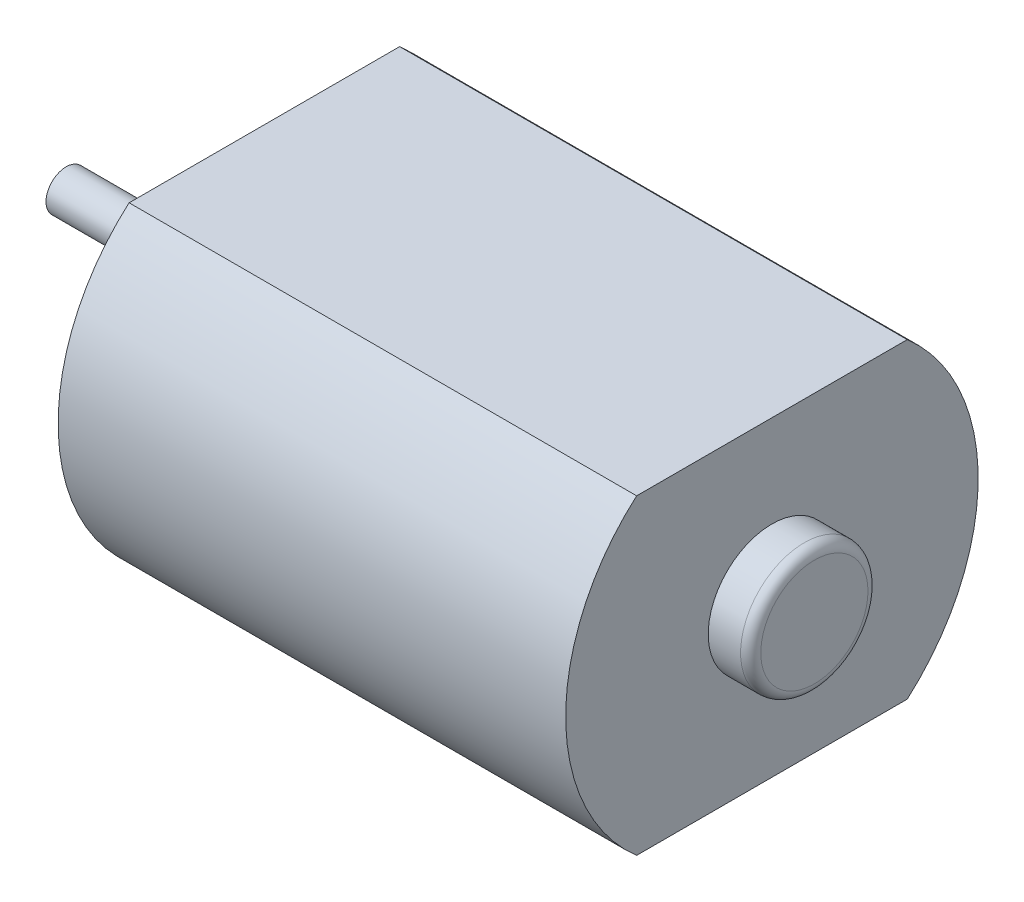
ISO-10303-21;
HEADER;
FILE_DESCRIPTION(('STEP AP214'),'2;1');
FILE_NAME('part.step','',(''),(''),'','','');
FILE_SCHEMA(('AUTOMOTIVE_DESIGN { 1 0 10303 214 1 1 1 1 }'));
ENDSEC;
DATA;
#1=APPLICATION_CONTEXT('core data for automotive mechanical design processes');
#2=APPLICATION_PROTOCOL_DEFINITION('international standard','automotive_design',2000,#1);
#3=PRODUCT_CONTEXT('',#1,'mechanical');
#4=PRODUCT('Part','Part','',(#3));
#5=PRODUCT_RELATED_PRODUCT_CATEGORY('part','',(#4));
#6=PRODUCT_DEFINITION_FORMATION('','',#4);
#7=PRODUCT_DEFINITION_CONTEXT('part definition',#1,'design');
#8=PRODUCT_DEFINITION('design','',#6,#7);
#9=PRODUCT_DEFINITION_SHAPE('','',#8);
#10=(LENGTH_UNIT() NAMED_UNIT(*) SI_UNIT(.MILLI.,.METRE.));
#11=(NAMED_UNIT(*) PLANE_ANGLE_UNIT() SI_UNIT($,.RADIAN.));
#12=(NAMED_UNIT(*) SI_UNIT($,.STERADIAN.) SOLID_ANGLE_UNIT());
#13=UNCERTAINTY_MEASURE_WITH_UNIT(LENGTH_MEASURE(1.E-05),#10,'distance_accuracy_value','');
#14=(GEOMETRIC_REPRESENTATION_CONTEXT(3) GLOBAL_UNCERTAINTY_ASSIGNED_CONTEXT((#13)) GLOBAL_UNIT_ASSIGNED_CONTEXT((#10,
#11,#12)) REPRESENTATION_CONTEXT('',''));
#15=CARTESIAN_POINT('',(0.,0.,0.));
#16=DIRECTION('',(0.,0.,1.));
#17=DIRECTION('',(1.,0.,0.));
#18=AXIS2_PLACEMENT_3D('',#15,#16,#17);
#19=CARTESIAN_POINT('',(25.1,0.,0.));
#20=DIRECTION('',(-1.,0.,0.));
#21=DIRECTION('',(0.,0.,1.));
#22=AXIS2_PLACEMENT_3D('',#19,#20,#21);
#23=CYLINDRICAL_SURFACE('',#22,10.2);
#24=DIRECTION('',(-1.,0.,0.));
#25=VECTOR('',#24,1.);
#26=CARTESIAN_POINT('',(25.1,-7.7,6.68954408012982));
#27=LINE('',#26,#25);
#28=CARTESIAN_POINT('',(25.1,-7.7,6.68954408012982));
#29=VERTEX_POINT('',#28);
#30=CARTESIAN_POINT('',(0.,-7.7,6.68954408012982));
#31=VERTEX_POINT('',#30);
#32=EDGE_CURVE('E54',#29,#31,#27,.T.);
#33=ORIENTED_EDGE('',*,*,#32,.F.);
#34=CARTESIAN_POINT('',(25.1,0.,0.));
#35=DIRECTION('',(1.,0.,0.));
#36=DIRECTION('',(0.,0.,-1.));
#37=AXIS2_PLACEMENT_3D('',#34,#35,#36);
#38=CIRCLE('',#37,10.2);
#39=CARTESIAN_POINT('',(25.1,7.7,6.68954408012983));
#40=VERTEX_POINT('',#39);
#41=EDGE_CURVE('E87',#40,#29,#38,.T.);
#42=ORIENTED_EDGE('',*,*,#41,.F.);
#43=DIRECTION('',(-1.,0.,0.));
#44=VECTOR('',#43,1.);
#45=CARTESIAN_POINT('',(25.1,7.7,6.68954408012983));
#46=LINE('',#45,#44);
#47=CARTESIAN_POINT('',(0.,7.7,6.68954408012983));
#48=VERTEX_POINT('',#47);
#49=EDGE_CURVE('E80',#48,#40,#46,.F.);
#50=ORIENTED_EDGE('',*,*,#49,.F.);
#51=CARTESIAN_POINT('',(0.,0.,0.));
#52=DIRECTION('',(1.,0.,0.));
#53=DIRECTION('',(0.,0.,-1.));
#54=AXIS2_PLACEMENT_3D('',#51,#52,#53);
#55=CIRCLE('',#54,10.2);
#56=EDGE_CURVE('E92',#48,#31,#55,.T.);
#57=ORIENTED_EDGE('',*,*,#56,.T.);
#58=EDGE_LOOP('',(#33,#42,#50,#57));
#59=FACE_BOUND('',#58,.T.);
#60=ADVANCED_FACE('F37',(#59),#23,.T.);
#61=DIRECTION('',(-1.,0.,0.));
#62=VECTOR('',#61,1.);
#63=CARTESIAN_POINT('',(25.1,-7.7,-6.68954408012982));
#64=LINE('',#63,#62);
#65=CARTESIAN_POINT('',(0.,-7.7,-6.68954408012982));
#66=VERTEX_POINT('',#65);
#67=CARTESIAN_POINT('',(25.1,-7.7,-6.68954408012982));
#68=VERTEX_POINT('',#67);
#69=EDGE_CURVE('E281',#66,#68,#64,.F.);
#70=ORIENTED_EDGE('',*,*,#69,.F.);
#71=CARTESIAN_POINT('',(0.,7.7,-6.68954408012983));
#72=VERTEX_POINT('',#71);
#73=EDGE_CURVE('E98',#66,#72,#55,.T.);
#74=ORIENTED_EDGE('',*,*,#73,.T.);
#75=DIRECTION('',(-1.,0.,0.));
#76=VECTOR('',#75,1.);
#77=CARTESIAN_POINT('',(25.1,7.7,-6.68954408012983));
#78=LINE('',#77,#76);
#79=CARTESIAN_POINT('',(25.1,7.7,-6.68954408012983));
#80=VERTEX_POINT('',#79);
#81=EDGE_CURVE('E62',#80,#72,#78,.T.);
#82=ORIENTED_EDGE('',*,*,#81,.F.);
#83=EDGE_CURVE('E97',#68,#80,#38,.T.);
#84=ORIENTED_EDGE('',*,*,#83,.F.);
#85=EDGE_LOOP('',(#70,#74,#82,#84));
#86=FACE_BOUND('',#85,.T.);
#87=ADVANCED_FACE('F129',(#86),#23,.T.);
#88=CARTESIAN_POINT('',(25.1,0.,0.));
#89=DIRECTION('',(1.,0.,0.));
#90=DIRECTION('',(0.,0.,-1.));
#91=AXIS2_PLACEMENT_3D('',#88,#89,#90);
#92=PLANE('',#91);
#93=CARTESIAN_POINT('',(25.1,0.,0.));
#94=DIRECTION('',(1.,0.,0.));
#95=DIRECTION('',(0.,0.,-1.));
#96=AXIS2_PLACEMENT_3D('',#93,#94,#95);
#97=CIRCLE('',#96,3.15);
#98=CARTESIAN_POINT('',(25.1,0.,-3.15));
#99=VERTEX_POINT('',#98);
#100=EDGE_CURVE('E105',#99,#99,#97,.T.);
#101=ORIENTED_EDGE('',*,*,#100,.F.);
#102=EDGE_LOOP('',(#101));
#103=FACE_BOUND('',#102,.T.);
#104=ORIENTED_EDGE('',*,*,#41,.T.);
#105=DIRECTION('',(0.,0.,-1.));
#106=VECTOR('',#105,1.);
#107=CARTESIAN_POINT('',(25.1,-7.7,0.));
#108=LINE('',#107,#106);
#109=EDGE_CURVE('E278',#29,#68,#108,.T.);
#110=ORIENTED_EDGE('',*,*,#109,.T.);
#111=ORIENTED_EDGE('',*,*,#83,.T.);
#112=DIRECTION('',(0.,0.,1.));
#113=VECTOR('',#112,1.);
#114=CARTESIAN_POINT('',(25.1,7.7,0.));
#115=LINE('',#114,#113);
#116=EDGE_CURVE('E94',#80,#40,#115,.T.);
#117=ORIENTED_EDGE('',*,*,#116,.T.);
#118=EDGE_LOOP('',(#104,#110,#111,#117));
#119=FACE_BOUND('',#118,.T.);
#120=ADVANCED_FACE('F133',(#103,#119),#92,.T.);
#121=CARTESIAN_POINT('',(0.,0.,0.));
#122=DIRECTION('',(1.,0.,0.));
#123=DIRECTION('',(0.,0.,-1.));
#124=AXIS2_PLACEMENT_3D('',#121,#122,#123);
#125=PLANE('',#124);
#126=CARTESIAN_POINT('',(0.,0.,6.2));
#127=DIRECTION('',(-1.,0.,0.));
#128=DIRECTION('',(0.,0.,1.));
#129=AXIS2_PLACEMENT_3D('',#126,#127,#128);
#130=CIRCLE('',#129,1.1);
#131=CARTESIAN_POINT('',(0.,0.,7.3));
#132=VERTEX_POINT('',#131);
#133=EDGE_CURVE('E258',#132,#132,#130,.T.);
#134=ORIENTED_EDGE('',*,*,#133,.F.);
#135=EDGE_LOOP('',(#134));
#136=FACE_BOUND('',#135,.T.);
#137=CARTESIAN_POINT('',(0.,0.,-6.2));
#138=DIRECTION('',(-1.,0.,0.));
#139=DIRECTION('',(0.,0.,1.));
#140=AXIS2_PLACEMENT_3D('',#137,#138,#139);
#141=CIRCLE('',#140,1.1);
#142=CARTESIAN_POINT('',(0.,0.,-5.1));
#143=VERTEX_POINT('',#142);
#144=EDGE_CURVE('E268',#143,#143,#141,.T.);
#145=ORIENTED_EDGE('',*,*,#144,.F.);
#146=EDGE_LOOP('',(#145));
#147=FACE_BOUND('',#146,.T.);
#148=CARTESIAN_POINT('',(0.,0.,0.));
#149=DIRECTION('',(-1.,0.,0.));
#150=DIRECTION('',(0.,0.,1.));
#151=AXIS2_PLACEMENT_3D('',#148,#149,#150);
#152=CIRCLE('',#151,3.075);
#153=CARTESIAN_POINT('',(0.,0.,3.075));
#154=VERTEX_POINT('',#153);
#155=EDGE_CURVE('E12',#154,#154,#152,.T.);
#156=ORIENTED_EDGE('',*,*,#155,.F.);
#157=EDGE_LOOP('',(#156));
#158=FACE_BOUND('',#157,.T.);
#159=DIRECTION('',(0.,0.,-1.));
#160=VECTOR('',#159,1.);
#161=CARTESIAN_POINT('',(0.,-7.7,0.));
#162=LINE('',#161,#160);
#163=EDGE_CURVE('E86',#31,#66,#162,.T.);
#164=ORIENTED_EDGE('',*,*,#163,.F.);
#165=ORIENTED_EDGE('',*,*,#56,.F.);
#166=DIRECTION('',(0.,0.,1.));
#167=VECTOR('',#166,1.);
#168=CARTESIAN_POINT('',(0.,7.7,0.));
#169=LINE('',#168,#167);
#170=EDGE_CURVE('E77',#72,#48,#169,.T.);
#171=ORIENTED_EDGE('',*,*,#170,.F.);
#172=ORIENTED_EDGE('',*,*,#73,.F.);
#173=EDGE_LOOP('',(#164,#165,#171,#172));
#174=FACE_BOUND('',#173,.T.);
#175=ADVANCED_FACE('F96',(#136,#147,#158,#174),#125,.F.);
#176=CARTESIAN_POINT('',(54.1,7.7,-14.9975074926587));
#177=DIRECTION('',(0.,1.,0.));
#178=DIRECTION('',(0.,0.,1.));
#179=AXIS2_PLACEMENT_3D('',#176,#177,#178);
#180=PLANE('',#179);
#181=ORIENTED_EDGE('',*,*,#81,.T.);
#182=ORIENTED_EDGE('',*,*,#170,.T.);
#183=ORIENTED_EDGE('',*,*,#49,.T.);
#184=ORIENTED_EDGE('',*,*,#116,.F.);
#185=EDGE_LOOP('',(#181,#182,#183,#184));
#186=FACE_BOUND('',#185,.T.);
#187=ADVANCED_FACE('F79',(#186),#180,.T.);
#188=CARTESIAN_POINT('',(54.1,-7.7,-14.9975074926587));
#189=DIRECTION('',(0.,-1.,0.));
#190=DIRECTION('',(0.,0.,-1.));
#191=AXIS2_PLACEMENT_3D('',#188,#189,#190);
#192=PLANE('',#191);
#193=ORIENTED_EDGE('',*,*,#32,.T.);
#194=ORIENTED_EDGE('',*,*,#163,.T.);
#195=ORIENTED_EDGE('',*,*,#69,.T.);
#196=ORIENTED_EDGE('',*,*,#109,.F.);
#197=EDGE_LOOP('',(#193,#194,#195,#196));
#198=FACE_BOUND('',#197,.T.);
#199=ADVANCED_FACE('F125',(#198),#192,.T.);
#200=CARTESIAN_POINT('',(27.2,0.,0.));
#201=DIRECTION('',(-1.,0.,0.));
#202=DIRECTION('',(0.,0.,1.));
#203=AXIS2_PLACEMENT_3D('',#200,#201,#202);
#204=CYLINDRICAL_SURFACE('',#203,3.15);
#205=CARTESIAN_POINT('',(26.7,0.,0.));
#206=DIRECTION('',(1.,0.,0.));
#207=DIRECTION('',(0.,0.,-1.));
#208=AXIS2_PLACEMENT_3D('',#205,#206,#207);
#209=CIRCLE('',#208,3.15);
#210=CARTESIAN_POINT('',(26.7,0.,-3.15));
#211=VERTEX_POINT('',#210);
#212=EDGE_CURVE('E46',#211,#211,#209,.F.);
#213=ORIENTED_EDGE('',*,*,#212,.T.);
#214=EDGE_LOOP('',(#213));
#215=FACE_BOUND('',#214,.T.);
#216=ORIENTED_EDGE('',*,*,#100,.T.);
#217=EDGE_LOOP('',(#216));
#218=FACE_BOUND('',#217,.T.);
#219=ADVANCED_FACE('F111',(#215,#218),#204,.T.);
#220=CARTESIAN_POINT('',(27.2,0.,0.));
#221=DIRECTION('',(1.,0.,0.));
#222=DIRECTION('',(0.,0.,-1.));
#223=AXIS2_PLACEMENT_3D('',#220,#221,#222);
#224=PLANE('',#223);
#225=CARTESIAN_POINT('',(27.2,0.,0.));
#226=DIRECTION('',(1.,0.,0.));
#227=DIRECTION('',(0.,0.,-1.));
#228=AXIS2_PLACEMENT_3D('',#225,#226,#227);
#229=CIRCLE('',#228,2.65);
#230=CARTESIAN_POINT('',(27.2,0.,-2.65));
#231=VERTEX_POINT('',#230);
#232=EDGE_CURVE('E106',#231,#231,#229,.T.);
#233=ORIENTED_EDGE('',*,*,#232,.T.);
#234=EDGE_LOOP('',(#233));
#235=FACE_BOUND('',#234,.T.);
#236=ADVANCED_FACE('F117',(#235),#224,.T.);
#237=CARTESIAN_POINT('',(26.7,0.,0.));
#238=DIRECTION('',(1.,0.,0.));
#239=DIRECTION('',(0.,0.,-1.));
#240=AXIS2_PLACEMENT_3D('',#237,#238,#239);
#241=TOROIDAL_SURFACE('',#240,2.65,0.5);
#242=ORIENTED_EDGE('',*,*,#212,.F.);
#243=EDGE_LOOP('',(#242));
#244=FACE_BOUND('',#243,.T.);
#245=ORIENTED_EDGE('',*,*,#232,.F.);
#246=EDGE_LOOP('',(#245));
#247=FACE_BOUND('',#246,.T.);
#248=ADVANCED_FACE('F39',(#244,#247),#241,.T.);
#249=CARTESIAN_POINT('',(-1.7,0.,0.));
#250=DIRECTION('',(1.,0.,0.));
#251=DIRECTION('',(0.,0.,-1.));
#252=AXIS2_PLACEMENT_3D('',#249,#250,#251);
#253=CYLINDRICAL_SURFACE('',#252,3.075);
#254=CARTESIAN_POINT('',(-1.7,0.,0.));
#255=DIRECTION('',(-1.,0.,0.));
#256=DIRECTION('',(0.,0.,1.));
#257=AXIS2_PLACEMENT_3D('',#254,#255,#256);
#258=CIRCLE('',#257,3.075);
#259=CARTESIAN_POINT('',(-1.7,0.,3.075));
#260=VERTEX_POINT('',#259);
#261=EDGE_CURVE('E271',#260,#260,#258,.T.);
#262=ORIENTED_EDGE('',*,*,#261,.F.);
#263=EDGE_LOOP('',(#262));
#264=FACE_BOUND('',#263,.T.);
#265=ORIENTED_EDGE('',*,*,#155,.T.);
#266=EDGE_LOOP('',(#265));
#267=FACE_BOUND('',#266,.T.);
#268=ADVANCED_FACE('F116',(#264,#267),#253,.T.);
#269=CARTESIAN_POINT('',(-1.7,0.,0.));
#270=DIRECTION('',(-1.,0.,0.));
#271=DIRECTION('',(0.,0.,1.));
#272=AXIS2_PLACEMENT_3D('',#269,#270,#271);
#273=PLANE('',#272);
#274=CARTESIAN_POINT('',(-1.7,0.,0.));
#275=DIRECTION('',(-1.,0.,0.));
#276=DIRECTION('',(0.,0.,1.));
#277=AXIS2_PLACEMENT_3D('',#274,#275,#276);
#278=CIRCLE('',#277,1.);
#279=CARTESIAN_POINT('',(-1.7,0.,1.));
#280=VERTEX_POINT('',#279);
#281=EDGE_CURVE('E41',#280,#280,#278,.F.);
#282=ORIENTED_EDGE('',*,*,#281,.T.);
#283=EDGE_LOOP('',(#282));
#284=FACE_BOUND('',#283,.T.);
#285=ORIENTED_EDGE('',*,*,#261,.T.);
#286=EDGE_LOOP('',(#285));
#287=FACE_BOUND('',#286,.T.);
#288=ADVANCED_FACE('F175',(#284,#287),#273,.T.);
#289=CARTESIAN_POINT('',(-9.8,0.,0.));
#290=DIRECTION('',(1.,0.,0.));
#291=DIRECTION('',(0.,0.,-1.));
#292=AXIS2_PLACEMENT_3D('',#289,#290,#291);
#293=CYLINDRICAL_SURFACE('',#292,1.);
#294=ORIENTED_EDGE('',*,*,#281,.F.);
#295=EDGE_LOOP('',(#294));
#296=FACE_BOUND('',#295,.T.);
#297=CARTESIAN_POINT('',(-9.8,0.,0.));
#298=DIRECTION('',(-1.,0.,0.));
#299=DIRECTION('',(0.,0.,1.));
#300=AXIS2_PLACEMENT_3D('',#297,#298,#299);
#301=CIRCLE('',#300,1.);
#302=CARTESIAN_POINT('',(-9.8,0.,1.));
#303=VERTEX_POINT('',#302);
#304=EDGE_CURVE('E257',#303,#303,#301,.T.);
#305=ORIENTED_EDGE('',*,*,#304,.F.);
#306=EDGE_LOOP('',(#305));
#307=FACE_BOUND('',#306,.T.);
#308=ADVANCED_FACE('F184',(#296,#307),#293,.T.);
#309=CARTESIAN_POINT('',(-9.8,0.,0.));
#310=DIRECTION('',(-1.,0.,0.));
#311=DIRECTION('',(0.,0.,1.));
#312=AXIS2_PLACEMENT_3D('',#309,#310,#311);
#313=PLANE('',#312);
#314=ORIENTED_EDGE('',*,*,#304,.T.);
#315=EDGE_LOOP('',(#314));
#316=FACE_BOUND('',#315,.T.);
#317=ADVANCED_FACE('F194',(#316),#313,.T.);
#318=CARTESIAN_POINT('',(3.,0.,-6.2));
#319=DIRECTION('',(-1.,0.,0.));
#320=DIRECTION('',(0.,0.,1.));
#321=AXIS2_PLACEMENT_3D('',#318,#319,#320);
#322=CYLINDRICAL_SURFACE('',#321,1.1);
#323=CARTESIAN_POINT('',(3.,0.,-6.2));
#324=DIRECTION('',(-1.,0.,0.));
#325=DIRECTION('',(0.,0.,1.));
#326=AXIS2_PLACEMENT_3D('',#323,#324,#325);
#327=CIRCLE('',#326,1.1);
#328=CARTESIAN_POINT('',(3.,0.,-5.1));
#329=VERTEX_POINT('',#328);
#330=EDGE_CURVE('E263',#329,#329,#327,.T.);
#331=ORIENTED_EDGE('',*,*,#330,.F.);
#332=EDGE_LOOP('',(#331));
#333=FACE_BOUND('',#332,.T.);
#334=ORIENTED_EDGE('',*,*,#144,.T.);
#335=EDGE_LOOP('',(#334));
#336=FACE_BOUND('',#335,.T.);
#337=ADVANCED_FACE('F204',(#333,#336),#322,.F.);
#338=CARTESIAN_POINT('',(3.,0.,-6.2));
#339=DIRECTION('',(-1.,0.,0.));
#340=DIRECTION('',(0.,0.,1.));
#341=AXIS2_PLACEMENT_3D('',#338,#339,#340);
#342=PLANE('',#341);
#343=ORIENTED_EDGE('',*,*,#330,.T.);
#344=EDGE_LOOP('',(#343));
#345=FACE_BOUND('',#344,.T.);
#346=ADVANCED_FACE('F220',(#345),#342,.T.);
#347=CARTESIAN_POINT('',(3.,0.,6.2));
#348=DIRECTION('',(-1.,0.,0.));
#349=DIRECTION('',(0.,0.,1.));
#350=AXIS2_PLACEMENT_3D('',#347,#348,#349);
#351=CYLINDRICAL_SURFACE('',#350,1.1);
#352=CARTESIAN_POINT('',(3.,0.,6.2));
#353=DIRECTION('',(-1.,0.,0.));
#354=DIRECTION('',(0.,0.,1.));
#355=AXIS2_PLACEMENT_3D('',#352,#353,#354);
#356=CIRCLE('',#355,1.1);
#357=CARTESIAN_POINT('',(3.,0.,7.3));
#358=VERTEX_POINT('',#357);
#359=EDGE_CURVE('E256',#358,#358,#356,.T.);
#360=ORIENTED_EDGE('',*,*,#359,.F.);
#361=EDGE_LOOP('',(#360));
#362=FACE_BOUND('',#361,.T.);
#363=ORIENTED_EDGE('',*,*,#133,.T.);
#364=EDGE_LOOP('',(#363));
#365=FACE_BOUND('',#364,.T.);
#366=ADVANCED_FACE('F230',(#362,#365),#351,.F.);
#367=CARTESIAN_POINT('',(3.,0.,6.2));
#368=DIRECTION('',(-1.,0.,0.));
#369=DIRECTION('',(0.,0.,1.));
#370=AXIS2_PLACEMENT_3D('',#367,#368,#369);
#371=PLANE('',#370);
#372=ORIENTED_EDGE('',*,*,#359,.T.);
#373=EDGE_LOOP('',(#372));
#374=FACE_BOUND('',#373,.T.);
#375=ADVANCED_FACE('F240',(#374),#371,.T.);
#376=CLOSED_SHELL('',(#60,#87,#120,#175,#187,#199,#219,#236,#248,#268,#288,#308,#317,#337,#346,
#366,#375));
#377=MANIFOLD_SOLID_BREP('B2',#376);
#378=ADVANCED_BREP_SHAPE_REPRESENTATION('',(#18,#377),#14);
#379=SHAPE_DEFINITION_REPRESENTATION(#9,#378);
ENDSEC;
END-ISO-10303-21;
